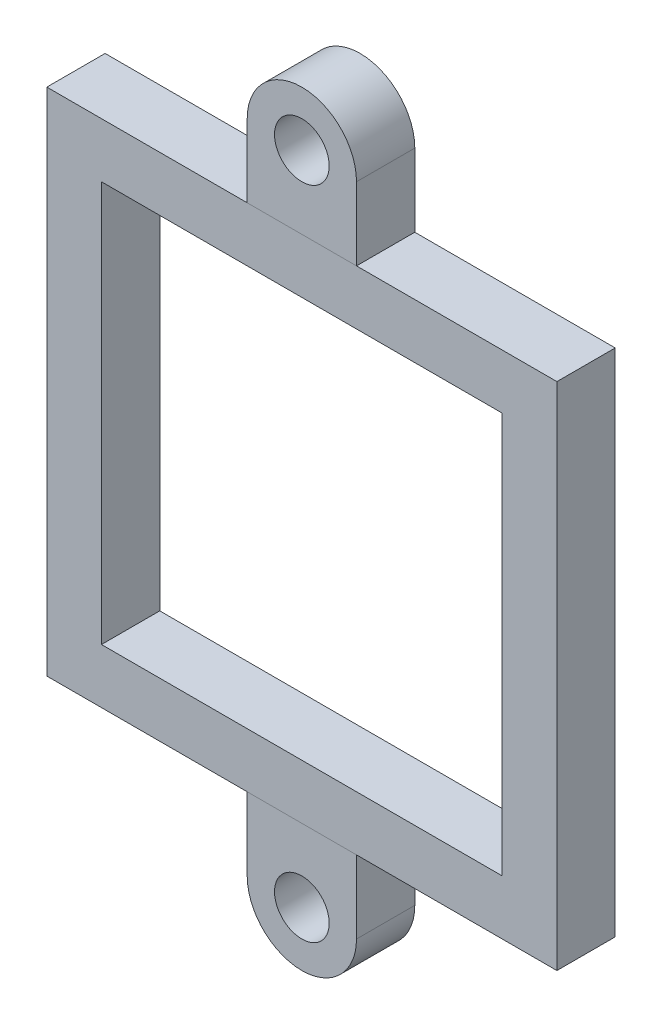
ISO-10303-21;
HEADER;
FILE_DESCRIPTION(('STEP AP214'),'2;1');
FILE_NAME('part.step','',(''),(''),'','','');
FILE_SCHEMA(('AUTOMOTIVE_DESIGN { 1 0 10303 214 1 1 1 1 }'));
ENDSEC;
DATA;
#1=APPLICATION_CONTEXT('core data for automotive mechanical design processes');
#2=APPLICATION_PROTOCOL_DEFINITION('international standard','automotive_design',2000,#1);
#3=PRODUCT_CONTEXT('',#1,'mechanical');
#4=PRODUCT('Part','Part','',(#3));
#5=PRODUCT_RELATED_PRODUCT_CATEGORY('part','',(#4));
#6=PRODUCT_DEFINITION_FORMATION('','',#4);
#7=PRODUCT_DEFINITION_CONTEXT('part definition',#1,'design');
#8=PRODUCT_DEFINITION('design','',#6,#7);
#9=PRODUCT_DEFINITION_SHAPE('','',#8);
#10=(LENGTH_UNIT() NAMED_UNIT(*) SI_UNIT(.MILLI.,.METRE.));
#11=(NAMED_UNIT(*) PLANE_ANGLE_UNIT() SI_UNIT($,.RADIAN.));
#12=(NAMED_UNIT(*) SI_UNIT($,.STERADIAN.) SOLID_ANGLE_UNIT());
#13=UNCERTAINTY_MEASURE_WITH_UNIT(LENGTH_MEASURE(1.E-05),#10,'distance_accuracy_value','');
#14=(GEOMETRIC_REPRESENTATION_CONTEXT(3) GLOBAL_UNCERTAINTY_ASSIGNED_CONTEXT((#13)) GLOBAL_UNIT_ASSIGNED_CONTEXT((#10,
#11,#12)) REPRESENTATION_CONTEXT('',''));
#15=CARTESIAN_POINT('',(0.,0.,0.));
#16=DIRECTION('',(0.,0.,1.));
#17=DIRECTION('',(1.,0.,0.));
#18=AXIS2_PLACEMENT_3D('',#15,#16,#17);
#19=CARTESIAN_POINT('',(-1.5,10.5,1.6));
#20=DIRECTION('',(0.,0.,-1.));
#21=DIRECTION('',(-1.,0.,0.));
#22=AXIS2_PLACEMENT_3D('',#19,#20,#21);
#23=PLANE('',#22);
#24=CARTESIAN_POINT('',(0.,9.,1.6));
#25=DIRECTION('',(0.,0.,1.));
#26=DIRECTION('',(-1.,0.,0.));
#27=AXIS2_PLACEMENT_3D('',#24,#25,#26);
#28=CIRCLE('',#27,0.75);
#29=CARTESIAN_POINT('',(-0.75,9.,1.6));
#30=VERTEX_POINT('',#29);
#31=EDGE_CURVE('E121',#30,#30,#28,.T.);
#32=ORIENTED_EDGE('',*,*,#31,.F.);
#33=EDGE_LOOP('',(#32));
#34=FACE_BOUND('',#33,.T.);
#35=CARTESIAN_POINT('',(0.,9.,1.6));
#36=DIRECTION('',(0.,0.,1.));
#37=DIRECTION('',(-1.,0.,0.));
#38=AXIS2_PLACEMENT_3D('',#35,#36,#37);
#39=CIRCLE('',#38,1.5);
#40=CARTESIAN_POINT('',(1.5,9.,1.6));
#41=VERTEX_POINT('',#40);
#42=CARTESIAN_POINT('',(-1.5,9.,1.6));
#43=VERTEX_POINT('',#42);
#44=EDGE_CURVE('E112',#41,#43,#39,.T.);
#45=ORIENTED_EDGE('',*,*,#44,.T.);
#46=DIRECTION('',(0.,-1.,0.));
#47=VECTOR('',#46,1.);
#48=CARTESIAN_POINT('',(-1.5,10.5,1.6));
#49=LINE('',#48,#47);
#50=CARTESIAN_POINT('',(-1.5,7.,1.6));
#51=VERTEX_POINT('',#50);
#52=EDGE_CURVE('E125',#43,#51,#49,.T.);
#53=ORIENTED_EDGE('',*,*,#52,.T.);
#54=DIRECTION('',(-1.,0.,0.));
#55=VECTOR('',#54,1.);
#56=CARTESIAN_POINT('',(-1.5,7.,1.6));
#57=LINE('',#56,#55);
#58=CARTESIAN_POINT('',(1.5,7.,1.6));
#59=VERTEX_POINT('',#58);
#60=EDGE_CURVE('E133',#59,#51,#57,.T.);
#61=ORIENTED_EDGE('',*,*,#60,.F.);
#62=DIRECTION('',(0.,-1.,0.));
#63=VECTOR('',#62,1.);
#64=CARTESIAN_POINT('',(1.5,10.5,1.6));
#65=LINE('',#64,#63);
#66=EDGE_CURVE('E74',#41,#59,#65,.T.);
#67=ORIENTED_EDGE('',*,*,#66,.F.);
#68=EDGE_LOOP('',(#45,#53,#61,#67));
#69=FACE_BOUND('',#68,.T.);
#70=ADVANCED_FACE('F66',(#34,#69),#23,.F.);
#71=CARTESIAN_POINT('',(-1.5,10.5,0.));
#72=DIRECTION('',(0.,0.,1.));
#73=DIRECTION('',(1.,0.,0.));
#74=AXIS2_PLACEMENT_3D('',#71,#72,#73);
#75=PLANE('',#74);
#76=CARTESIAN_POINT('',(0.,9.,0.));
#77=DIRECTION('',(0.,0.,1.));
#78=DIRECTION('',(-1.,0.,0.));
#79=AXIS2_PLACEMENT_3D('',#76,#77,#78);
#80=CIRCLE('',#79,0.75);
#81=CARTESIAN_POINT('',(-0.75,9.,0.));
#82=VERTEX_POINT('',#81);
#83=EDGE_CURVE('E142',#82,#82,#80,.T.);
#84=ORIENTED_EDGE('',*,*,#83,.T.);
#85=EDGE_LOOP('',(#84));
#86=FACE_BOUND('',#85,.T.);
#87=DIRECTION('',(0.,-1.,0.));
#88=VECTOR('',#87,1.);
#89=CARTESIAN_POINT('',(1.5,10.5,0.));
#90=LINE('',#89,#88);
#91=CARTESIAN_POINT('',(1.5,9.,0.));
#92=VERTEX_POINT('',#91);
#93=CARTESIAN_POINT('',(1.5,7.,0.));
#94=VERTEX_POINT('',#93);
#95=EDGE_CURVE('E118',#92,#94,#90,.T.);
#96=ORIENTED_EDGE('',*,*,#95,.T.);
#97=DIRECTION('',(1.,0.,0.));
#98=VECTOR('',#97,1.);
#99=CARTESIAN_POINT('',(-1.5,7.,0.));
#100=LINE('',#99,#98);
#101=CARTESIAN_POINT('',(-1.5,7.,0.));
#102=VERTEX_POINT('',#101);
#103=EDGE_CURVE('E123',#102,#94,#100,.T.);
#104=ORIENTED_EDGE('',*,*,#103,.F.);
#105=DIRECTION('',(0.,-1.,0.));
#106=VECTOR('',#105,1.);
#107=CARTESIAN_POINT('',(-1.5,10.5,0.));
#108=LINE('',#107,#106);
#109=CARTESIAN_POINT('',(-1.5,9.,0.));
#110=VERTEX_POINT('',#109);
#111=EDGE_CURVE('E119',#110,#102,#108,.T.);
#112=ORIENTED_EDGE('',*,*,#111,.F.);
#113=CARTESIAN_POINT('',(0.,9.,0.));
#114=DIRECTION('',(0.,0.,1.));
#115=DIRECTION('',(-1.,0.,0.));
#116=AXIS2_PLACEMENT_3D('',#113,#114,#115);
#117=CIRCLE('',#116,1.5);
#118=EDGE_CURVE('E109',#92,#110,#117,.T.);
#119=ORIENTED_EDGE('',*,*,#118,.F.);
#120=EDGE_LOOP('',(#96,#104,#112,#119));
#121=FACE_BOUND('',#120,.T.);
#122=ADVANCED_FACE('F116',(#86,#121),#75,.F.);
#123=CARTESIAN_POINT('',(-1.5,10.5,1.6));
#124=DIRECTION('',(1.,0.,0.));
#125=DIRECTION('',(0.,0.,-1.));
#126=AXIS2_PLACEMENT_3D('',#123,#124,#125);
#127=PLANE('',#126);
#128=DIRECTION('',(0.,0.,-1.));
#129=VECTOR('',#128,1.);
#130=CARTESIAN_POINT('',(-1.5,9.,4.));
#131=LINE('',#130,#129);
#132=EDGE_CURVE('E120',#43,#110,#131,.T.);
#133=ORIENTED_EDGE('',*,*,#132,.T.);
#134=ORIENTED_EDGE('',*,*,#111,.T.);
#135=DIRECTION('',(0.,0.,-1.));
#136=VECTOR('',#135,1.);
#137=CARTESIAN_POINT('',(-1.5,7.,1.6));
#138=LINE('',#137,#136);
#139=EDGE_CURVE('E88',#51,#102,#138,.T.);
#140=ORIENTED_EDGE('',*,*,#139,.F.);
#141=ORIENTED_EDGE('',*,*,#52,.F.);
#142=EDGE_LOOP('',(#133,#134,#140,#141));
#143=FACE_BOUND('',#142,.T.);
#144=ADVANCED_FACE('F157',(#143),#127,.F.);
#145=CARTESIAN_POINT('',(1.5,10.5,1.6));
#146=DIRECTION('',(-1.,0.,0.));
#147=DIRECTION('',(0.,0.,1.));
#148=AXIS2_PLACEMENT_3D('',#145,#146,#147);
#149=PLANE('',#148);
#150=ORIENTED_EDGE('',*,*,#66,.T.);
#151=DIRECTION('',(0.,0.,1.));
#152=VECTOR('',#151,1.);
#153=CARTESIAN_POINT('',(1.5,7.,1.6));
#154=LINE('',#153,#152);
#155=EDGE_CURVE('E81',#94,#59,#154,.T.);
#156=ORIENTED_EDGE('',*,*,#155,.F.);
#157=ORIENTED_EDGE('',*,*,#95,.F.);
#158=DIRECTION('',(0.,0.,-1.));
#159=VECTOR('',#158,1.);
#160=CARTESIAN_POINT('',(1.5,9.,4.));
#161=LINE('',#160,#159);
#162=EDGE_CURVE('E13',#41,#92,#161,.T.);
#163=ORIENTED_EDGE('',*,*,#162,.F.);
#164=EDGE_LOOP('',(#150,#156,#157,#163));
#165=FACE_BOUND('',#164,.T.);
#166=ADVANCED_FACE('F68',(#165),#149,.F.);
#167=CARTESIAN_POINT('',(0.,7.,0.));
#168=DIRECTION('',(0.,1.,0.));
#169=DIRECTION('',(0.,0.,-1.));
#170=AXIS2_PLACEMENT_3D('',#167,#168,#169);
#171=PLANE('',#170);
#172=ORIENTED_EDGE('',*,*,#155,.T.);
#173=ORIENTED_EDGE('',*,*,#60,.T.);
#174=ORIENTED_EDGE('',*,*,#139,.T.);
#175=ORIENTED_EDGE('',*,*,#103,.T.);
#176=EDGE_LOOP('',(#172,#173,#174,#175));
#177=FACE_BOUND('',#176,.T.);
#178=ADVANCED_FACE('F163',(#177),#171,.F.);
#179=CARTESIAN_POINT('',(0.,9.,4.));
#180=DIRECTION('',(0.,0.,-1.));
#181=DIRECTION('',(-1.,0.,0.));
#182=AXIS2_PLACEMENT_3D('',#179,#180,#181);
#183=CYLINDRICAL_SURFACE('',#182,1.5);
#184=ORIENTED_EDGE('',*,*,#44,.F.);
#185=ORIENTED_EDGE('',*,*,#162,.T.);
#186=ORIENTED_EDGE('',*,*,#118,.T.);
#187=ORIENTED_EDGE('',*,*,#132,.F.);
#188=EDGE_LOOP('',(#184,#185,#186,#187));
#189=FACE_BOUND('',#188,.T.);
#190=ADVANCED_FACE('F108',(#189),#183,.T.);
#191=CARTESIAN_POINT('',(0.,9.,4.));
#192=DIRECTION('',(0.,0.,-1.));
#193=DIRECTION('',(-1.,0.,0.));
#194=AXIS2_PLACEMENT_3D('',#191,#192,#193);
#195=CYLINDRICAL_SURFACE('',#194,0.75);
#196=ORIENTED_EDGE('',*,*,#83,.F.);
#197=EDGE_LOOP('',(#196));
#198=FACE_BOUND('',#197,.T.);
#199=ORIENTED_EDGE('',*,*,#31,.T.);
#200=EDGE_LOOP('',(#199));
#201=FACE_BOUND('',#200,.T.);
#202=ADVANCED_FACE('F147',(#198,#201),#195,.F.);
#203=CLOSED_SHELL('',(#70,#122,#144,#166,#178,#190,#202));
#204=MANIFOLD_SOLID_BREP('B2',#203);
#205=CARTESIAN_POINT('',(-1.5,-10.5,1.6));
#206=DIRECTION('',(0.,0.,-1.));
#207=DIRECTION('',(-1.,0.,0.));
#208=AXIS2_PLACEMENT_3D('',#205,#206,#207);
#209=PLANE('',#208);
#210=CARTESIAN_POINT('',(0.,-9.,1.6));
#211=DIRECTION('',(0.,0.,-1.));
#212=DIRECTION('',(-1.,0.,0.));
#213=AXIS2_PLACEMENT_3D('',#210,#211,#212);
#214=CIRCLE('',#213,0.75);
#215=CARTESIAN_POINT('',(-0.75,-9.,1.6));
#216=VERTEX_POINT('',#215);
#217=EDGE_CURVE('E270',#216,#216,#214,.T.);
#218=ORIENTED_EDGE('',*,*,#217,.T.);
#219=EDGE_LOOP('',(#218));
#220=FACE_BOUND('',#219,.T.);
#221=CARTESIAN_POINT('',(0.,-9.,1.6));
#222=DIRECTION('',(0.,0.,-1.));
#223=DIRECTION('',(-1.,0.,0.));
#224=AXIS2_PLACEMENT_3D('',#221,#222,#223);
#225=CIRCLE('',#224,1.5);
#226=CARTESIAN_POINT('',(1.5,-9.,1.6));
#227=VERTEX_POINT('',#226);
#228=CARTESIAN_POINT('',(-1.5,-9.,1.6));
#229=VERTEX_POINT('',#228);
#230=EDGE_CURVE('E289',#227,#229,#225,.T.);
#231=ORIENTED_EDGE('',*,*,#230,.F.);
#232=DIRECTION('',(0.,1.,0.));
#233=VECTOR('',#232,1.);
#234=CARTESIAN_POINT('',(1.5,-10.5,1.6));
#235=LINE('',#234,#233);
#236=CARTESIAN_POINT('',(1.5,-7.,1.6));
#237=VERTEX_POINT('',#236);
#238=EDGE_CURVE('E231',#227,#237,#235,.T.);
#239=ORIENTED_EDGE('',*,*,#238,.T.);
#240=DIRECTION('',(-1.,0.,0.));
#241=VECTOR('',#240,1.);
#242=CARTESIAN_POINT('',(-1.5,-7.,1.6));
#243=LINE('',#242,#241);
#244=CARTESIAN_POINT('',(-1.5,-7.,1.6));
#245=VERTEX_POINT('',#244);
#246=EDGE_CURVE('E287',#237,#245,#243,.T.);
#247=ORIENTED_EDGE('',*,*,#246,.T.);
#248=DIRECTION('',(0.,1.,0.));
#249=VECTOR('',#248,1.);
#250=CARTESIAN_POINT('',(-1.5,-10.5,1.6));
#251=LINE('',#250,#249);
#252=EDGE_CURVE('E277',#229,#245,#251,.T.);
#253=ORIENTED_EDGE('',*,*,#252,.F.);
#254=EDGE_LOOP('',(#231,#239,#247,#253));
#255=FACE_BOUND('',#254,.T.);
#256=ADVANCED_FACE('F223',(#220,#255),#209,.F.);
#257=CARTESIAN_POINT('',(-1.5,-10.5,0.));
#258=DIRECTION('',(0.,0.,1.));
#259=DIRECTION('',(1.,0.,0.));
#260=AXIS2_PLACEMENT_3D('',#257,#258,#259);
#261=PLANE('',#260);
#262=CARTESIAN_POINT('',(0.,-9.,0.));
#263=DIRECTION('',(0.,0.,-1.));
#264=DIRECTION('',(-1.,0.,0.));
#265=AXIS2_PLACEMENT_3D('',#262,#263,#264);
#266=CIRCLE('',#265,0.75);
#267=CARTESIAN_POINT('',(-0.75,-9.,0.));
#268=VERTEX_POINT('',#267);
#269=EDGE_CURVE('E302',#268,#268,#266,.T.);
#270=ORIENTED_EDGE('',*,*,#269,.F.);
#271=EDGE_LOOP('',(#270));
#272=FACE_BOUND('',#271,.T.);
#273=DIRECTION('',(0.,1.,0.));
#274=VECTOR('',#273,1.);
#275=CARTESIAN_POINT('',(1.5,-10.5,0.));
#276=LINE('',#275,#274);
#277=CARTESIAN_POINT('',(1.5,-9.,0.));
#278=VERTEX_POINT('',#277);
#279=CARTESIAN_POINT('',(1.5,-7.,0.));
#280=VERTEX_POINT('',#279);
#281=EDGE_CURVE('E237',#278,#280,#276,.T.);
#282=ORIENTED_EDGE('',*,*,#281,.F.);
#283=CARTESIAN_POINT('',(0.,-9.,0.));
#284=DIRECTION('',(0.,0.,-1.));
#285=DIRECTION('',(-1.,0.,0.));
#286=AXIS2_PLACEMENT_3D('',#283,#284,#285);
#287=CIRCLE('',#286,1.5);
#288=CARTESIAN_POINT('',(-1.5,-9.,0.));
#289=VERTEX_POINT('',#288);
#290=EDGE_CURVE('E265',#278,#289,#287,.T.);
#291=ORIENTED_EDGE('',*,*,#290,.T.);
#292=DIRECTION('',(0.,1.,0.));
#293=VECTOR('',#292,1.);
#294=CARTESIAN_POINT('',(-1.5,-10.5,0.));
#295=LINE('',#294,#293);
#296=CARTESIAN_POINT('',(-1.5,-7.,0.));
#297=VERTEX_POINT('',#296);
#298=EDGE_CURVE('E244',#289,#297,#295,.T.);
#299=ORIENTED_EDGE('',*,*,#298,.T.);
#300=DIRECTION('',(1.,0.,0.));
#301=VECTOR('',#300,1.);
#302=CARTESIAN_POINT('',(-1.5,-7.,0.));
#303=LINE('',#302,#301);
#304=EDGE_CURVE('E274',#297,#280,#303,.T.);
#305=ORIENTED_EDGE('',*,*,#304,.T.);
#306=EDGE_LOOP('',(#282,#291,#299,#305));
#307=FACE_BOUND('',#306,.T.);
#308=ADVANCED_FACE('F272',(#272,#307),#261,.F.);
#309=CARTESIAN_POINT('',(-1.5,-10.5,1.6));
#310=DIRECTION('',(1.,0.,0.));
#311=DIRECTION('',(0.,0.,-1.));
#312=AXIS2_PLACEMENT_3D('',#309,#310,#311);
#313=PLANE('',#312);
#314=DIRECTION('',(0.,0.,-1.));
#315=VECTOR('',#314,1.);
#316=CARTESIAN_POINT('',(-1.5,-9.,4.));
#317=LINE('',#316,#315);
#318=EDGE_CURVE('E269',#229,#289,#317,.T.);
#319=ORIENTED_EDGE('',*,*,#318,.F.);
#320=ORIENTED_EDGE('',*,*,#252,.T.);
#321=DIRECTION('',(0.,0.,-1.));
#322=VECTOR('',#321,1.);
#323=CARTESIAN_POINT('',(-1.5,-7.,1.6));
#324=LINE('',#323,#322);
#325=EDGE_CURVE('E279',#245,#297,#324,.T.);
#326=ORIENTED_EDGE('',*,*,#325,.T.);
#327=ORIENTED_EDGE('',*,*,#298,.F.);
#328=EDGE_LOOP('',(#319,#320,#326,#327));
#329=FACE_BOUND('',#328,.T.);
#330=ADVANCED_FACE('F298',(#329),#313,.F.);
#331=CARTESIAN_POINT('',(1.5,-10.5,1.6));
#332=DIRECTION('',(-1.,0.,0.));
#333=DIRECTION('',(0.,0.,1.));
#334=AXIS2_PLACEMENT_3D('',#331,#332,#333);
#335=PLANE('',#334);
#336=ORIENTED_EDGE('',*,*,#238,.F.);
#337=DIRECTION('',(0.,0.,-1.));
#338=VECTOR('',#337,1.);
#339=CARTESIAN_POINT('',(1.5,-9.,4.));
#340=LINE('',#339,#338);
#341=EDGE_CURVE('E64',#227,#278,#340,.T.);
#342=ORIENTED_EDGE('',*,*,#341,.T.);
#343=ORIENTED_EDGE('',*,*,#281,.T.);
#344=DIRECTION('',(0.,0.,1.));
#345=VECTOR('',#344,1.);
#346=CARTESIAN_POINT('',(1.5,-7.,1.6));
#347=LINE('',#346,#345);
#348=EDGE_CURVE('E292',#280,#237,#347,.T.);
#349=ORIENTED_EDGE('',*,*,#348,.T.);
#350=EDGE_LOOP('',(#336,#342,#343,#349));
#351=FACE_BOUND('',#350,.T.);
#352=ADVANCED_FACE('F225',(#351),#335,.F.);
#353=CARTESIAN_POINT('',(0.,-7.,0.));
#354=DIRECTION('',(0.,-1.,0.));
#355=DIRECTION('',(0.,0.,-1.));
#356=AXIS2_PLACEMENT_3D('',#353,#354,#355);
#357=PLANE('',#356);
#358=ORIENTED_EDGE('',*,*,#348,.F.);
#359=ORIENTED_EDGE('',*,*,#304,.F.);
#360=ORIENTED_EDGE('',*,*,#325,.F.);
#361=ORIENTED_EDGE('',*,*,#246,.F.);
#362=EDGE_LOOP('',(#358,#359,#360,#361));
#363=FACE_BOUND('',#362,.T.);
#364=ADVANCED_FACE('F291',(#363),#357,.F.);
#365=CARTESIAN_POINT('',(0.,-9.,4.));
#366=DIRECTION('',(0.,0.,-1.));
#367=DIRECTION('',(-1.,0.,0.));
#368=AXIS2_PLACEMENT_3D('',#365,#366,#367);
#369=CYLINDRICAL_SURFACE('',#368,1.5);
#370=ORIENTED_EDGE('',*,*,#230,.T.);
#371=ORIENTED_EDGE('',*,*,#318,.T.);
#372=ORIENTED_EDGE('',*,*,#290,.F.);
#373=ORIENTED_EDGE('',*,*,#341,.F.);
#374=EDGE_LOOP('',(#370,#371,#372,#373));
#375=FACE_BOUND('',#374,.T.);
#376=ADVANCED_FACE('F266',(#375),#369,.T.);
#377=CARTESIAN_POINT('',(0.,-9.,4.));
#378=DIRECTION('',(0.,0.,-1.));
#379=DIRECTION('',(-1.,0.,0.));
#380=AXIS2_PLACEMENT_3D('',#377,#378,#379);
#381=CYLINDRICAL_SURFACE('',#380,0.75);
#382=ORIENTED_EDGE('',*,*,#269,.T.);
#383=EDGE_LOOP('',(#382));
#384=FACE_BOUND('',#383,.T.);
#385=ORIENTED_EDGE('',*,*,#217,.F.);
#386=EDGE_LOOP('',(#385));
#387=FACE_BOUND('',#386,.T.);
#388=ADVANCED_FACE('F306',(#384,#387),#381,.F.);
#389=CLOSED_SHELL('',(#256,#308,#330,#352,#364,#376,#388));
#390=MANIFOLD_SOLID_BREP('B7',#389);
#391=CARTESIAN_POINT('',(0.,0.,1.6));
#392=DIRECTION('',(0.,0.,1.));
#393=DIRECTION('',(1.,0.,0.));
#394=AXIS2_PLACEMENT_3D('',#391,#392,#393);
#395=PLANE('',#394);
#396=DIRECTION('',(0.,1.,0.));
#397=VECTOR('',#396,1.);
#398=CARTESIAN_POINT('',(-7.,0.,1.6));
#399=LINE('',#398,#397);
#400=CARTESIAN_POINT('',(-7.,-7.,1.6));
#401=VERTEX_POINT('',#400);
#402=CARTESIAN_POINT('',(-7.,7.,1.6));
#403=VERTEX_POINT('',#402);
#404=EDGE_CURVE('E471',#401,#403,#399,.T.);
#405=ORIENTED_EDGE('',*,*,#404,.F.);
#406=DIRECTION('',(-1.,0.,0.));
#407=VECTOR('',#406,1.);
#408=CARTESIAN_POINT('',(0.,-7.,1.6));
#409=LINE('',#408,#407);
#410=CARTESIAN_POINT('',(7.,-7.,1.6));
#411=VERTEX_POINT('',#410);
#412=EDGE_CURVE('E474',#411,#401,#409,.T.);
#413=ORIENTED_EDGE('',*,*,#412,.F.);
#414=DIRECTION('',(0.,1.,0.));
#415=VECTOR('',#414,1.);
#416=CARTESIAN_POINT('',(7.,0.,1.6));
#417=LINE('',#416,#415);
#418=CARTESIAN_POINT('',(7.,7.,1.6));
#419=VERTEX_POINT('',#418);
#420=EDGE_CURVE('E478',#411,#419,#417,.T.);
#421=ORIENTED_EDGE('',*,*,#420,.T.);
#422=DIRECTION('',(-1.,0.,0.));
#423=VECTOR('',#422,1.);
#424=CARTESIAN_POINT('',(0.,7.,1.6));
#425=LINE('',#424,#423);
#426=EDGE_CURVE('E480',#419,#403,#425,.T.);
#427=ORIENTED_EDGE('',*,*,#426,.T.);
#428=EDGE_LOOP('',(#405,#413,#421,#427));
#429=FACE_BOUND('',#428,.T.);
#430=DIRECTION('',(0.,1.,0.));
#431=VECTOR('',#430,1.);
#432=CARTESIAN_POINT('',(-5.5,0.,1.6));
#433=LINE('',#432,#431);
#434=CARTESIAN_POINT('',(-5.5,-5.5,1.6));
#435=VERTEX_POINT('',#434);
#436=CARTESIAN_POINT('',(-5.5,5.5,1.6));
#437=VERTEX_POINT('',#436);
#438=EDGE_CURVE('E467',#435,#437,#433,.T.);
#439=ORIENTED_EDGE('',*,*,#438,.T.);
#440=DIRECTION('',(1.,0.,0.));
#441=VECTOR('',#440,1.);
#442=CARTESIAN_POINT('',(0.,5.5,1.6));
#443=LINE('',#442,#441);
#444=CARTESIAN_POINT('',(5.5,5.5,1.6));
#445=VERTEX_POINT('',#444);
#446=EDGE_CURVE('E438',#437,#445,#443,.T.);
#447=ORIENTED_EDGE('',*,*,#446,.T.);
#448=DIRECTION('',(0.,1.,0.));
#449=VECTOR('',#448,1.);
#450=CARTESIAN_POINT('',(5.5,0.,1.6));
#451=LINE('',#450,#449);
#452=CARTESIAN_POINT('',(5.5,-5.5,1.6));
#453=VERTEX_POINT('',#452);
#454=EDGE_CURVE('E441',#453,#445,#451,.T.);
#455=ORIENTED_EDGE('',*,*,#454,.F.);
#456=DIRECTION('',(1.,0.,0.));
#457=VECTOR('',#456,1.);
#458=CARTESIAN_POINT('',(0.,-5.5,1.6));
#459=LINE('',#458,#457);
#460=EDGE_CURVE('E465',#435,#453,#459,.T.);
#461=ORIENTED_EDGE('',*,*,#460,.F.);
#462=EDGE_LOOP('',(#439,#447,#455,#461));
#463=FACE_BOUND('',#462,.T.);
#464=ADVANCED_FACE('F371',(#429,#463),#395,.T.);
#465=CARTESIAN_POINT('',(0.,0.,0.));
#466=DIRECTION('',(0.,0.,1.));
#467=DIRECTION('',(1.,0.,0.));
#468=AXIS2_PLACEMENT_3D('',#465,#466,#467);
#469=PLANE('',#468);
#470=DIRECTION('',(0.,1.,0.));
#471=VECTOR('',#470,1.);
#472=CARTESIAN_POINT('',(-7.,0.,0.));
#473=LINE('',#472,#471);
#474=CARTESIAN_POINT('',(-7.,-7.,0.));
#475=VERTEX_POINT('',#474);
#476=CARTESIAN_POINT('',(-7.,7.,0.));
#477=VERTEX_POINT('',#476);
#478=EDGE_CURVE('E470',#475,#477,#473,.T.);
#479=ORIENTED_EDGE('',*,*,#478,.T.);
#480=DIRECTION('',(-1.,0.,0.));
#481=VECTOR('',#480,1.);
#482=CARTESIAN_POINT('',(0.,7.,0.));
#483=LINE('',#482,#481);
#484=CARTESIAN_POINT('',(7.,7.,0.));
#485=VERTEX_POINT('',#484);
#486=EDGE_CURVE('E475',#485,#477,#483,.T.);
#487=ORIENTED_EDGE('',*,*,#486,.F.);
#488=DIRECTION('',(0.,1.,0.));
#489=VECTOR('',#488,1.);
#490=CARTESIAN_POINT('',(7.,0.,0.));
#491=LINE('',#490,#489);
#492=CARTESIAN_POINT('',(7.,-7.,0.));
#493=VERTEX_POINT('',#492);
#494=EDGE_CURVE('E488',#493,#485,#491,.T.);
#495=ORIENTED_EDGE('',*,*,#494,.F.);
#496=DIRECTION('',(-1.,0.,0.));
#497=VECTOR('',#496,1.);
#498=CARTESIAN_POINT('',(0.,-7.,0.));
#499=LINE('',#498,#497);
#500=EDGE_CURVE('E485',#493,#475,#499,.T.);
#501=ORIENTED_EDGE('',*,*,#500,.T.);
#502=EDGE_LOOP('',(#479,#487,#495,#501));
#503=FACE_BOUND('',#502,.T.);
#504=DIRECTION('',(-1.,0.,0.));
#505=VECTOR('',#504,1.);
#506=CARTESIAN_POINT('',(5.5,5.5,0.));
#507=LINE('',#506,#505);
#508=CARTESIAN_POINT('',(5.5,5.5,0.));
#509=VERTEX_POINT('',#508);
#510=CARTESIAN_POINT('',(-5.5,5.5,0.));
#511=VERTEX_POINT('',#510);
#512=EDGE_CURVE('E394',#509,#511,#507,.T.);
#513=ORIENTED_EDGE('',*,*,#512,.T.);
#514=DIRECTION('',(0.,-1.,0.));
#515=VECTOR('',#514,1.);
#516=CARTESIAN_POINT('',(-5.5,5.5,0.));
#517=LINE('',#516,#515);
#518=CARTESIAN_POINT('',(-5.5,-5.5,0.));
#519=VERTEX_POINT('',#518);
#520=EDGE_CURVE('E445',#511,#519,#517,.T.);
#521=ORIENTED_EDGE('',*,*,#520,.T.);
#522=DIRECTION('',(-1.,0.,0.));
#523=VECTOR('',#522,1.);
#524=CARTESIAN_POINT('',(5.5,-5.5,0.));
#525=LINE('',#524,#523);
#526=CARTESIAN_POINT('',(5.5,-5.5,0.));
#527=VERTEX_POINT('',#526);
#528=EDGE_CURVE('E451',#527,#519,#525,.T.);
#529=ORIENTED_EDGE('',*,*,#528,.F.);
#530=DIRECTION('',(0.,-1.,0.));
#531=VECTOR('',#530,1.);
#532=CARTESIAN_POINT('',(5.5,5.5,0.));
#533=LINE('',#532,#531);
#534=EDGE_CURVE('E455',#509,#527,#533,.T.);
#535=ORIENTED_EDGE('',*,*,#534,.F.);
#536=EDGE_LOOP('',(#513,#521,#529,#535));
#537=FACE_BOUND('',#536,.T.);
#538=ADVANCED_FACE('F454',(#503,#537),#469,.F.);
#539=CARTESIAN_POINT('',(-7.,0.,1.6));
#540=DIRECTION('',(-1.,0.,0.));
#541=DIRECTION('',(0.,0.,1.));
#542=AXIS2_PLACEMENT_3D('',#539,#540,#541);
#543=PLANE('',#542);
#544=ORIENTED_EDGE('',*,*,#478,.F.);
#545=DIRECTION('',(0.,0.,-1.));
#546=VECTOR('',#545,1.);
#547=CARTESIAN_POINT('',(-7.,-7.,1.6));
#548=LINE('',#547,#546);
#549=EDGE_CURVE('E221',#401,#475,#548,.T.);
#550=ORIENTED_EDGE('',*,*,#549,.F.);
#551=ORIENTED_EDGE('',*,*,#404,.T.);
#552=DIRECTION('',(0.,0.,-1.));
#553=VECTOR('',#552,1.);
#554=CARTESIAN_POINT('',(-7.,7.,1.6));
#555=LINE('',#554,#553);
#556=EDGE_CURVE('E482',#403,#477,#555,.T.);
#557=ORIENTED_EDGE('',*,*,#556,.T.);
#558=EDGE_LOOP('',(#544,#550,#551,#557));
#559=FACE_BOUND('',#558,.T.);
#560=ADVANCED_FACE('F373',(#559),#543,.T.);
#561=CARTESIAN_POINT('',(0.,-7.,1.6));
#562=DIRECTION('',(0.,-1.,0.));
#563=DIRECTION('',(1.,0.,0.));
#564=AXIS2_PLACEMENT_3D('',#561,#562,#563);
#565=PLANE('',#564);
#566=ORIENTED_EDGE('',*,*,#500,.F.);
#567=DIRECTION('',(0.,0.,-1.));
#568=VECTOR('',#567,1.);
#569=CARTESIAN_POINT('',(7.,-7.,1.6));
#570=LINE('',#569,#568);
#571=EDGE_CURVE('E379',#411,#493,#570,.T.);
#572=ORIENTED_EDGE('',*,*,#571,.F.);
#573=ORIENTED_EDGE('',*,*,#412,.T.);
#574=ORIENTED_EDGE('',*,*,#549,.T.);
#575=EDGE_LOOP('',(#566,#572,#573,#574));
#576=FACE_BOUND('',#575,.T.);
#577=ADVANCED_FACE('F505',(#576),#565,.T.);
#578=CARTESIAN_POINT('',(7.,0.,1.6));
#579=DIRECTION('',(-1.,0.,0.));
#580=DIRECTION('',(0.,0.,1.));
#581=AXIS2_PLACEMENT_3D('',#578,#579,#580);
#582=PLANE('',#581);
#583=ORIENTED_EDGE('',*,*,#494,.T.);
#584=DIRECTION('',(0.,0.,-1.));
#585=VECTOR('',#584,1.);
#586=CARTESIAN_POINT('',(7.,7.,1.6));
#587=LINE('',#586,#585);
#588=EDGE_CURVE('E493',#419,#485,#587,.T.);
#589=ORIENTED_EDGE('',*,*,#588,.F.);
#590=ORIENTED_EDGE('',*,*,#420,.F.);
#591=ORIENTED_EDGE('',*,*,#571,.T.);
#592=EDGE_LOOP('',(#583,#589,#590,#591));
#593=FACE_BOUND('',#592,.T.);
#594=ADVANCED_FACE('F498',(#593),#582,.F.);
#595=CARTESIAN_POINT('',(0.,7.,1.6));
#596=DIRECTION('',(0.,-1.,0.));
#597=DIRECTION('',(1.,0.,0.));
#598=AXIS2_PLACEMENT_3D('',#595,#596,#597);
#599=PLANE('',#598);
#600=ORIENTED_EDGE('',*,*,#486,.T.);
#601=ORIENTED_EDGE('',*,*,#556,.F.);
#602=ORIENTED_EDGE('',*,*,#426,.F.);
#603=ORIENTED_EDGE('',*,*,#588,.T.);
#604=EDGE_LOOP('',(#600,#601,#602,#603));
#605=FACE_BOUND('',#604,.T.);
#606=ADVANCED_FACE('F512',(#605),#599,.F.);
#607=CARTESIAN_POINT('',(5.5,5.5,10.));
#608=DIRECTION('',(0.,-1.,0.));
#609=DIRECTION('',(0.,0.,-1.));
#610=AXIS2_PLACEMENT_3D('',#607,#608,#609);
#611=PLANE('',#610);
#612=DIRECTION('',(0.,0.,-1.));
#613=VECTOR('',#612,1.);
#614=CARTESIAN_POINT('',(-5.5,5.5,10.));
#615=LINE('',#614,#613);
#616=EDGE_CURVE('E434',#437,#511,#615,.T.);
#617=ORIENTED_EDGE('',*,*,#616,.T.);
#618=ORIENTED_EDGE('',*,*,#512,.F.);
#619=DIRECTION('',(0.,0.,-1.));
#620=VECTOR('',#619,1.);
#621=CARTESIAN_POINT('',(5.5,5.5,10.));
#622=LINE('',#621,#620);
#623=EDGE_CURVE('E460',#445,#509,#622,.T.);
#624=ORIENTED_EDGE('',*,*,#623,.F.);
#625=ORIENTED_EDGE('',*,*,#446,.F.);
#626=EDGE_LOOP('',(#617,#618,#624,#625));
#627=FACE_BOUND('',#626,.T.);
#628=ADVANCED_FACE('F436',(#627),#611,.T.);
#629=CARTESIAN_POINT('',(-5.5,5.5,10.));
#630=DIRECTION('',(1.,0.,0.));
#631=DIRECTION('',(0.,1.,0.));
#632=AXIS2_PLACEMENT_3D('',#629,#630,#631);
#633=PLANE('',#632);
#634=DIRECTION('',(0.,0.,-1.));
#635=VECTOR('',#634,1.);
#636=CARTESIAN_POINT('',(-5.5,-5.5,10.));
#637=LINE('',#636,#635);
#638=EDGE_CURVE('E442',#435,#519,#637,.T.);
#639=ORIENTED_EDGE('',*,*,#638,.T.);
#640=ORIENTED_EDGE('',*,*,#520,.F.);
#641=ORIENTED_EDGE('',*,*,#616,.F.);
#642=ORIENTED_EDGE('',*,*,#438,.F.);
#643=EDGE_LOOP('',(#639,#640,#641,#642));
#644=FACE_BOUND('',#643,.T.);
#645=ADVANCED_FACE('F446',(#644),#633,.T.);
#646=CARTESIAN_POINT('',(5.5,-5.5,10.));
#647=DIRECTION('',(0.,-1.,0.));
#648=DIRECTION('',(0.,0.,-1.));
#649=AXIS2_PLACEMENT_3D('',#646,#647,#648);
#650=PLANE('',#649);
#651=ORIENTED_EDGE('',*,*,#460,.T.);
#652=DIRECTION('',(0.,0.,-1.));
#653=VECTOR('',#652,1.);
#654=CARTESIAN_POINT('',(5.5,-5.5,10.));
#655=LINE('',#654,#653);
#656=EDGE_CURVE('E386',#453,#527,#655,.T.);
#657=ORIENTED_EDGE('',*,*,#656,.T.);
#658=ORIENTED_EDGE('',*,*,#528,.T.);
#659=ORIENTED_EDGE('',*,*,#638,.F.);
#660=EDGE_LOOP('',(#651,#657,#658,#659));
#661=FACE_BOUND('',#660,.T.);
#662=ADVANCED_FACE('F520',(#661),#650,.F.);
#663=CARTESIAN_POINT('',(5.5,5.5,10.));
#664=DIRECTION('',(1.,0.,0.));
#665=DIRECTION('',(0.,1.,0.));
#666=AXIS2_PLACEMENT_3D('',#663,#664,#665);
#667=PLANE('',#666);
#668=ORIENTED_EDGE('',*,*,#454,.T.);
#669=ORIENTED_EDGE('',*,*,#623,.T.);
#670=ORIENTED_EDGE('',*,*,#534,.T.);
#671=ORIENTED_EDGE('',*,*,#656,.F.);
#672=EDGE_LOOP('',(#668,#669,#670,#671));
#673=FACE_BOUND('',#672,.T.);
#674=ADVANCED_FACE('F521',(#673),#667,.F.);
#675=CLOSED_SHELL('',(#464,#538,#560,#577,#594,#606,#628,#645,#662,#674));
#676=MANIFOLD_SOLID_BREP('B58',#675);
#677=ADVANCED_BREP_SHAPE_REPRESENTATION('',(#18,#204,#390,#676),#14);
#678=SHAPE_DEFINITION_REPRESENTATION(#9,#677);
ENDSEC;
END-ISO-10303-21;
